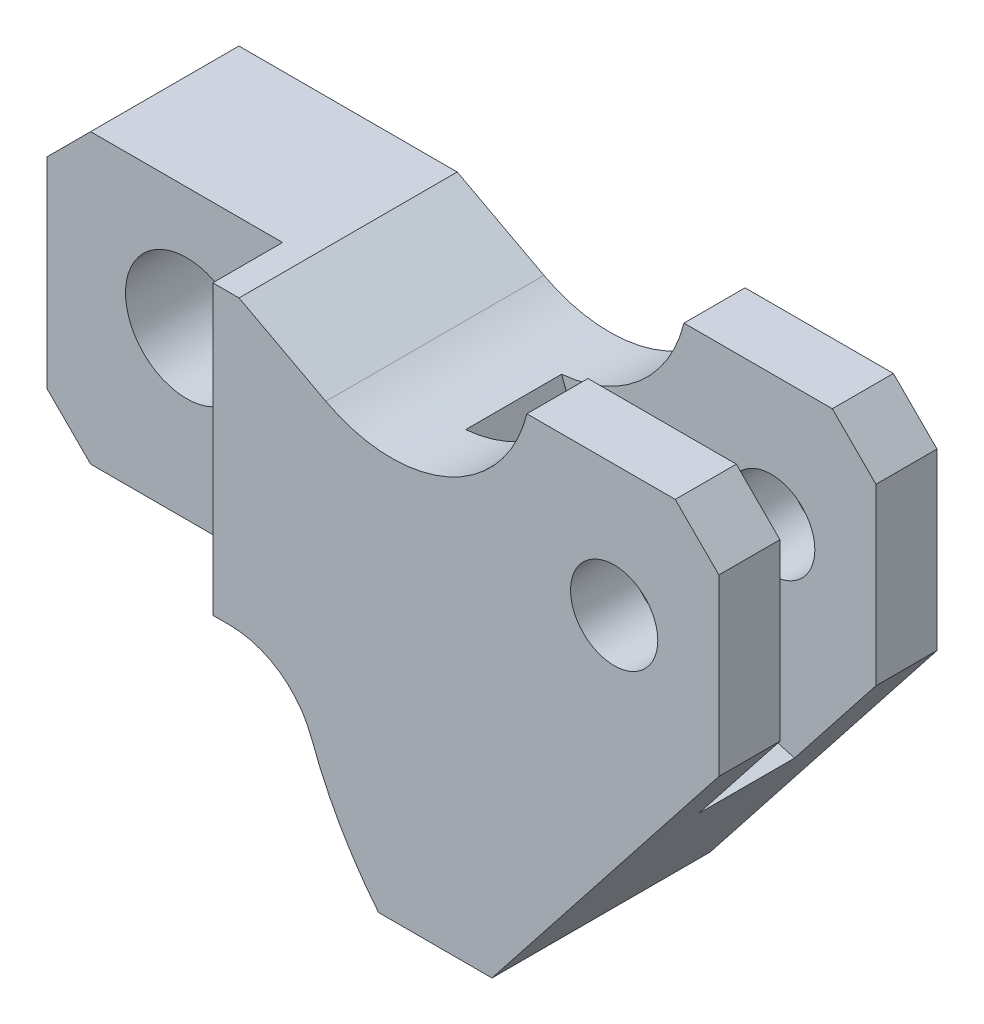
ISO-10303-21;
HEADER;
FILE_DESCRIPTION(('STEP AP214'),'2;1');
FILE_NAME('part.step','',(''),(''),'','','');
FILE_SCHEMA(('AUTOMOTIVE_DESIGN { 1 0 10303 214 1 1 1 1 }'));
ENDSEC;
DATA;
#1=APPLICATION_CONTEXT('core data for automotive mechanical design processes');
#2=APPLICATION_PROTOCOL_DEFINITION('international standard','automotive_design',2000,#1);
#3=PRODUCT_CONTEXT('',#1,'mechanical');
#4=PRODUCT('Part','Part','',(#3));
#5=PRODUCT_RELATED_PRODUCT_CATEGORY('part','',(#4));
#6=PRODUCT_DEFINITION_FORMATION('','',#4);
#7=PRODUCT_DEFINITION_CONTEXT('part definition',#1,'design');
#8=PRODUCT_DEFINITION('design','',#6,#7);
#9=PRODUCT_DEFINITION_SHAPE('','',#8);
#10=(LENGTH_UNIT() NAMED_UNIT(*) SI_UNIT(.MILLI.,.METRE.));
#11=(NAMED_UNIT(*) PLANE_ANGLE_UNIT() SI_UNIT($,.RADIAN.));
#12=(NAMED_UNIT(*) SI_UNIT($,.STERADIAN.) SOLID_ANGLE_UNIT());
#13=UNCERTAINTY_MEASURE_WITH_UNIT(LENGTH_MEASURE(1.E-05),#10,'distance_accuracy_value','');
#14=(GEOMETRIC_REPRESENTATION_CONTEXT(3) GLOBAL_UNCERTAINTY_ASSIGNED_CONTEXT((#13)) GLOBAL_UNIT_ASSIGNED_CONTEXT((#10,
#11,#12)) REPRESENTATION_CONTEXT('',''));
#15=CARTESIAN_POINT('',(0.,0.,0.));
#16=DIRECTION('',(0.,0.,1.));
#17=DIRECTION('',(1.,0.,0.));
#18=AXIS2_PLACEMENT_3D('',#15,#16,#17);
#19=CARTESIAN_POINT('',(37.5323662073748,-3.84,12.5));
#20=DIRECTION('',(0.,0.,-1.));
#21=DIRECTION('',(-1.,0.,0.));
#22=AXIS2_PLACEMENT_3D('',#19,#20,#21);
#23=CYLINDRICAL_SURFACE('',#22,38.);
#24=CARTESIAN_POINT('',(37.5323662073748,-3.84,-5.5));
#25=DIRECTION('',(0.,0.,1.));
#26=DIRECTION('',(1.,0.,0.));
#27=AXIS2_PLACEMENT_3D('',#24,#25,#26);
#28=CIRCLE('',#27,38.);
#29=CARTESIAN_POINT('',(1.50656721275614,-15.9289125565259,-5.5));
#30=VERTEX_POINT('',#29);
#31=CARTESIAN_POINT('',(28.2057199185503,-40.677666443508,-5.5));
#32=VERTEX_POINT('',#31);
#33=EDGE_CURVE('E423',#30,#32,#28,.T.);
#34=ORIENTED_EDGE('',*,*,#33,.F.);
#35=DIRECTION('',(0.,0.,-1.));
#36=VECTOR('',#35,1.);
#37=CARTESIAN_POINT('',(1.50656721275614,-15.9289125565259,12.5));
#38=LINE('',#37,#36);
#39=CARTESIAN_POINT('',(1.50656721275614,-15.9289125565259,5.5));
#40=VERTEX_POINT('',#39);
#41=EDGE_CURVE('E311',#40,#30,#38,.T.);
#42=ORIENTED_EDGE('',*,*,#41,.F.);
#43=CARTESIAN_POINT('',(37.5323662073748,-3.84,5.5));
#44=DIRECTION('',(0.,0.,1.));
#45=DIRECTION('',(1.,0.,0.));
#46=AXIS2_PLACEMENT_3D('',#43,#44,#45);
#47=CIRCLE('',#46,38.);
#48=CARTESIAN_POINT('',(28.2057199185503,-40.677666443508,5.5));
#49=VERTEX_POINT('',#48);
#50=EDGE_CURVE('E243',#40,#49,#47,.T.);
#51=ORIENTED_EDGE('',*,*,#50,.T.);
#52=DIRECTION('',(0.,0.,-1.));
#53=VECTOR('',#52,1.);
#54=CARTESIAN_POINT('',(28.2057199185503,-40.677666443508,12.5));
#55=LINE('',#54,#53);
#56=EDGE_CURVE('E279',#49,#32,#55,.T.);
#57=ORIENTED_EDGE('',*,*,#56,.T.);
#58=EDGE_LOOP('',(#34,#42,#51,#57));
#59=FACE_BOUND('',#58,.T.);
#60=ADVANCED_FACE('F43',(#59),#23,.F.);
#61=CARTESIAN_POINT('',(0.,-8.84000000000001,4.5));
#62=DIRECTION('',(0.,1.,0.));
#63=DIRECTION('',(0.,0.,1.));
#64=AXIS2_PLACEMENT_3D('',#61,#62,#63);
#65=PLANE('',#64);
#66=DIRECTION('',(1.,0.,0.));
#67=VECTOR('',#66,1.);
#68=CARTESIAN_POINT('',(0.,-8.84000000000001,-12.5));
#69=LINE('',#68,#67);
#70=CARTESIAN_POINT('',(-42.4676337926252,-8.84000000000001,-12.5));
#71=VERTEX_POINT('',#70);
#72=CARTESIAN_POINT('',(-17.4552495373706,-8.84000000000001,-12.5));
#73=VERTEX_POINT('',#72);
#74=EDGE_CURVE('E335',#71,#73,#69,.T.);
#75=ORIENTED_EDGE('',*,*,#74,.F.);
#76=DIRECTION('',(0.,0.,1.));
#77=VECTOR('',#76,1.);
#78=CARTESIAN_POINT('',(-42.4676337926252,-8.84000000000001,4.5));
#79=LINE('',#78,#77);
#80=CARTESIAN_POINT('',(-42.4676337926252,-8.84000000000001,4.5));
#81=VERTEX_POINT('',#80);
#82=EDGE_CURVE('E11',#71,#81,#79,.T.);
#83=ORIENTED_EDGE('',*,*,#82,.T.);
#84=DIRECTION('',(1.,0.,0.));
#85=VECTOR('',#84,1.);
#86=CARTESIAN_POINT('',(0.,-8.84000000000001,4.5));
#87=LINE('',#86,#85);
#88=CARTESIAN_POINT('',(-20.4676337926252,-8.84000000000001,4.5));
#89=VERTEX_POINT('',#88);
#90=EDGE_CURVE('E323',#81,#89,#87,.T.);
#91=ORIENTED_EDGE('',*,*,#90,.T.);
#92=DIRECTION('',(0.,0.,-1.));
#93=VECTOR('',#92,1.);
#94=CARTESIAN_POINT('',(-20.4676337926252,-8.84000000000001,12.5));
#95=LINE('',#94,#93);
#96=CARTESIAN_POINT('',(-20.4676337926252,-8.84000000000001,12.5));
#97=VERTEX_POINT('',#96);
#98=EDGE_CURVE('E301',#97,#89,#95,.T.);
#99=ORIENTED_EDGE('',*,*,#98,.F.);
#100=DIRECTION('',(1.,0.,0.));
#101=VECTOR('',#100,1.);
#102=CARTESIAN_POINT('',(0.,-8.84000000000001,12.5));
#103=LINE('',#102,#101);
#104=CARTESIAN_POINT('',(-17.4552495373706,-8.84000000000001,12.5));
#105=VERTEX_POINT('',#104);
#106=EDGE_CURVE('E265',#97,#105,#103,.T.);
#107=ORIENTED_EDGE('',*,*,#106,.T.);
#108=DIRECTION('',(0.,0.,-1.));
#109=VECTOR('',#108,1.);
#110=CARTESIAN_POINT('',(-17.4552495373706,-8.84000000000001,12.5));
#111=LINE('',#110,#109);
#112=EDGE_CURVE('E306',#105,#73,#111,.T.);
#113=ORIENTED_EDGE('',*,*,#112,.T.);
#114=EDGE_LOOP('',(#75,#83,#91,#99,#107,#113));
#115=FACE_BOUND('',#114,.T.);
#116=ADVANCED_FACE('F383',(#115),#65,.T.);
#117=CARTESIAN_POINT('',(-47.4676337926252,0.,4.5));
#118=DIRECTION('',(1.,0.,0.));
#119=DIRECTION('',(0.,1.,0.));
#120=AXIS2_PLACEMENT_3D('',#117,#118,#119);
#121=PLANE('',#120);
#122=DIRECTION('',(0.,-1.,0.));
#123=VECTOR('',#122,1.);
#124=CARTESIAN_POINT('',(-47.4676337926252,0.,-12.5));
#125=LINE('',#124,#123);
#126=CARTESIAN_POINT('',(-47.4676337926252,-13.84,-12.5));
#127=VERTEX_POINT('',#126);
#128=CARTESIAN_POINT('',(-47.4676337926252,-36.84,-12.5));
#129=VERTEX_POINT('',#128);
#130=EDGE_CURVE('E331',#127,#129,#125,.T.);
#131=ORIENTED_EDGE('',*,*,#130,.T.);
#132=DIRECTION('',(0.,0.,1.));
#133=VECTOR('',#132,1.);
#134=CARTESIAN_POINT('',(-47.4676337926252,-36.84,4.5));
#135=LINE('',#134,#133);
#136=CARTESIAN_POINT('',(-47.4676337926252,-36.84,4.5));
#137=VERTEX_POINT('',#136);
#138=EDGE_CURVE('E64',#129,#137,#135,.T.);
#139=ORIENTED_EDGE('',*,*,#138,.T.);
#140=DIRECTION('',(0.,-1.,0.));
#141=VECTOR('',#140,1.);
#142=CARTESIAN_POINT('',(-47.4676337926252,0.,4.5));
#143=LINE('',#142,#141);
#144=CARTESIAN_POINT('',(-47.4676337926252,-13.84,4.5));
#145=VERTEX_POINT('',#144);
#146=EDGE_CURVE('E324',#145,#137,#143,.T.);
#147=ORIENTED_EDGE('',*,*,#146,.F.);
#148=DIRECTION('',(0.,0.,-1.));
#149=VECTOR('',#148,1.);
#150=CARTESIAN_POINT('',(-47.4676337926252,-13.84,-12.5));
#151=LINE('',#150,#149);
#152=EDGE_CURVE('E356',#145,#127,#151,.T.);
#153=ORIENTED_EDGE('',*,*,#152,.T.);
#154=EDGE_LOOP('',(#131,#139,#147,#153));
#155=FACE_BOUND('',#154,.T.);
#156=ADVANCED_FACE('F379',(#155),#121,.F.);
#157=CARTESIAN_POINT('',(-31.4676337926252,-22.84,4.5));
#158=DIRECTION('',(0.,0.,-1.));
#159=DIRECTION('',(-1.,0.,0.));
#160=AXIS2_PLACEMENT_3D('',#157,#158,#159);
#161=CYLINDRICAL_SURFACE('',#160,7.);
#162=CARTESIAN_POINT('',(-31.4676337926252,-22.84,4.5));
#163=DIRECTION('',(0.,0.,1.));
#164=DIRECTION('',(1.,0.,0.));
#165=AXIS2_PLACEMENT_3D('',#162,#163,#164);
#166=CIRCLE('',#165,7.);
#167=CARTESIAN_POINT('',(-24.4676337926252,-22.84,4.5));
#168=VERTEX_POINT('',#167);
#169=EDGE_CURVE('E316',#168,#168,#166,.T.);
#170=ORIENTED_EDGE('',*,*,#169,.T.);
#171=EDGE_LOOP('',(#170));
#172=FACE_BOUND('',#171,.T.);
#173=CARTESIAN_POINT('',(-31.4676337926252,-22.84,-12.5));
#174=DIRECTION('',(0.,0.,1.));
#175=DIRECTION('',(1.,0.,0.));
#176=AXIS2_PLACEMENT_3D('',#173,#174,#175);
#177=CIRCLE('',#176,7.);
#178=CARTESIAN_POINT('',(-24.4676337926252,-22.84,-12.5));
#179=VERTEX_POINT('',#178);
#180=EDGE_CURVE('E312',#179,#179,#177,.T.);
#181=ORIENTED_EDGE('',*,*,#180,.F.);
#182=EDGE_LOOP('',(#181));
#183=FACE_BOUND('',#182,.T.);
#184=ADVANCED_FACE('F478',(#172,#183),#161,.F.);
#185=CARTESIAN_POINT('',(0.,-41.84,4.5));
#186=DIRECTION('',(0.,1.,0.));
#187=DIRECTION('',(-1.,0.,0.));
#188=AXIS2_PLACEMENT_3D('',#185,#186,#187);
#189=PLANE('',#188);
#190=DIRECTION('',(1.,0.,0.));
#191=VECTOR('',#190,1.);
#192=CARTESIAN_POINT('',(0.,-41.84,4.5));
#193=LINE('',#192,#191);
#194=CARTESIAN_POINT('',(-42.4676337926251,-41.84,4.5));
#195=VERTEX_POINT('',#194);
#196=CARTESIAN_POINT('',(-20.4676337926252,-41.84,4.5));
#197=VERTEX_POINT('',#196);
#198=EDGE_CURVE('E330',#195,#197,#193,.T.);
#199=ORIENTED_EDGE('',*,*,#198,.F.);
#200=DIRECTION('',(0.,0.,-1.));
#201=VECTOR('',#200,1.);
#202=CARTESIAN_POINT('',(-42.4676337926251,-41.84,4.5));
#203=LINE('',#202,#201);
#204=CARTESIAN_POINT('',(-42.4676337926251,-41.84,-12.5));
#205=VERTEX_POINT('',#204);
#206=EDGE_CURVE('E359',#195,#205,#203,.T.);
#207=ORIENTED_EDGE('',*,*,#206,.T.);
#208=DIRECTION('',(1.,0.,0.));
#209=VECTOR('',#208,1.);
#210=CARTESIAN_POINT('',(0.,-41.84,-12.5));
#211=LINE('',#210,#209);
#212=CARTESIAN_POINT('',(-18.5358006446889,-41.84,-12.5));
#213=VERTEX_POINT('',#212);
#214=EDGE_CURVE('E319',#205,#213,#211,.T.);
#215=ORIENTED_EDGE('',*,*,#214,.T.);
#216=DIRECTION('',(0.,0.,-1.));
#217=VECTOR('',#216,1.);
#218=CARTESIAN_POINT('',(-18.5358006446889,-41.84,12.5));
#219=LINE('',#218,#217);
#220=CARTESIAN_POINT('',(-18.5358006446889,-41.84,12.5));
#221=VERTEX_POINT('',#220);
#222=EDGE_CURVE('E298',#221,#213,#219,.T.);
#223=ORIENTED_EDGE('',*,*,#222,.F.);
#224=DIRECTION('',(1.,0.,0.));
#225=VECTOR('',#224,1.);
#226=CARTESIAN_POINT('',(0.,-41.84,12.5));
#227=LINE('',#226,#225);
#228=CARTESIAN_POINT('',(-20.4676337926252,-41.84,12.5));
#229=VERTEX_POINT('',#228);
#230=EDGE_CURVE('E270',#229,#221,#227,.T.);
#231=ORIENTED_EDGE('',*,*,#230,.F.);
#232=DIRECTION('',(0.,0.,-1.));
#233=VECTOR('',#232,1.);
#234=CARTESIAN_POINT('',(-20.4676337926252,-41.84,12.5));
#235=LINE('',#234,#233);
#236=EDGE_CURVE('E304',#229,#197,#235,.T.);
#237=ORIENTED_EDGE('',*,*,#236,.T.);
#238=EDGE_LOOP('',(#199,#207,#215,#223,#231,#237));
#239=FACE_BOUND('',#238,.T.);
#240=ADVANCED_FACE('F373',(#239),#189,.F.);
#241=CARTESIAN_POINT('',(0.,0.,4.5));
#242=DIRECTION('',(0.,0.,1.));
#243=DIRECTION('',(1.,0.,0.));
#244=AXIS2_PLACEMENT_3D('',#241,#242,#243);
#245=PLANE('',#244);
#246=ORIENTED_EDGE('',*,*,#169,.F.);
#247=EDGE_LOOP('',(#246));
#248=FACE_BOUND('',#247,.T.);
#249=ORIENTED_EDGE('',*,*,#146,.T.);
#250=DIRECTION('',(-0.707106781186547,0.707106781186549,0.));
#251=VECTOR('',#250,1.);
#252=CARTESIAN_POINT('',(-42.1538168963126,-42.1538168963125,4.5));
#253=LINE('',#252,#251);
#254=EDGE_CURVE('E55',#137,#195,#253,.F.);
#255=ORIENTED_EDGE('',*,*,#254,.T.);
#256=ORIENTED_EDGE('',*,*,#198,.T.);
#257=DIRECTION('',(0.,-1.,0.));
#258=VECTOR('',#257,1.);
#259=CARTESIAN_POINT('',(-20.4676337926252,0.,4.5));
#260=LINE('',#259,#258);
#261=EDGE_CURVE('E317',#89,#197,#260,.T.);
#262=ORIENTED_EDGE('',*,*,#261,.F.);
#263=ORIENTED_EDGE('',*,*,#90,.F.);
#264=DIRECTION('',(-0.707106781186548,-0.707106781186547,0.));
#265=VECTOR('',#264,1.);
#266=CARTESIAN_POINT('',(-16.8138168963125,16.8138168963126,4.5));
#267=LINE('',#266,#265);
#268=EDGE_CURVE('E365',#81,#145,#267,.T.);
#269=ORIENTED_EDGE('',*,*,#268,.T.);
#270=EDGE_LOOP('',(#249,#255,#256,#262,#263,#269));
#271=FACE_BOUND('',#270,.T.);
#272=ADVANCED_FACE('F366',(#248,#271),#245,.T.);
#273=CARTESIAN_POINT('',(0.,0.,-12.5));
#274=DIRECTION('',(0.,0.,1.));
#275=DIRECTION('',(1.,0.,0.));
#276=AXIS2_PLACEMENT_3D('',#273,#274,#275);
#277=PLANE('',#276);
#278=ORIENTED_EDGE('',*,*,#180,.T.);
#279=EDGE_LOOP('',(#278));
#280=FACE_BOUND('',#279,.T.);
#281=DIRECTION('',(1.,0.,0.));
#282=VECTOR('',#281,1.);
#283=CARTESIAN_POINT('',(0.,-3.84,-12.5));
#284=LINE('',#283,#282);
#285=CARTESIAN_POINT('',(15.5323662073748,-3.84,-12.5));
#286=VERTEX_POINT('',#285);
#287=CARTESIAN_POINT('',(32.5323662073748,-3.84,-12.5));
#288=VERTEX_POINT('',#287);
#289=EDGE_CURVE('E200',#286,#288,#284,.T.);
#290=ORIENTED_EDGE('',*,*,#289,.T.);
#291=DIRECTION('',(-0.707106781186549,0.707106781186547,0.));
#292=VECTOR('',#291,1.);
#293=CARTESIAN_POINT('',(37.5323662073748,-8.84,-12.5));
#294=LINE('',#293,#292);
#295=CARTESIAN_POINT('',(37.5323662073748,-8.84000000000001,-12.5));
#296=VERTEX_POINT('',#295);
#297=EDGE_CURVE('E354',#288,#296,#294,.F.);
#298=ORIENTED_EDGE('',*,*,#297,.T.);
#299=DIRECTION('',(0.,-1.,0.));
#300=VECTOR('',#299,1.);
#301=CARTESIAN_POINT('',(37.5323662073748,0.,-12.5));
#302=LINE('',#301,#300);
#303=CARTESIAN_POINT('',(37.5323662073748,-28.84,-12.5));
#304=VERTEX_POINT('',#303);
#305=EDGE_CURVE('E214',#296,#304,#302,.T.);
#306=ORIENTED_EDGE('',*,*,#305,.T.);
#307=DIRECTION('',(-0.618872226603513,-0.785491672227536,0.));
#308=VECTOR('',#307,1.);
#309=CARTESIAN_POINT('',(37.1770350140687,-29.2909972838117,-12.5));
#310=LINE('',#309,#308);
#311=CARTESIAN_POINT('',(11.5323662073748,-61.84,-12.5));
#312=VERTEX_POINT('',#311);
#313=EDGE_CURVE('E259',#304,#312,#310,.T.);
#314=ORIENTED_EDGE('',*,*,#313,.T.);
#315=DIRECTION('',(-1.,0.,0.));
#316=VECTOR('',#315,1.);
#317=CARTESIAN_POINT('',(0.,-61.84,-12.5));
#318=LINE('',#317,#316);
#319=CARTESIAN_POINT('',(-1.46763379262515,-61.84,-12.5));
#320=VERTEX_POINT('',#319);
#321=EDGE_CURVE('E288',#312,#320,#318,.T.);
#322=ORIENTED_EDGE('',*,*,#321,.T.);
#323=CARTESIAN_POINT('',(34.9455217358851,-32.1233025984293,-12.5));
#324=DIRECTION('',(0.,0.,1.));
#325=DIRECTION('',(1.,0.,0.));
#326=AXIS2_PLACEMENT_3D('',#323,#324,#325);
#327=CIRCLE('',#326,47.);
#328=CARTESIAN_POINT('',(-9.15311250774611,-48.3809302804262,-12.5));
#329=VERTEX_POINT('',#328);
#330=EDGE_CURVE('E282',#329,#320,#327,.T.);
#331=ORIENTED_EDGE('',*,*,#330,.F.);
#332=CARTESIAN_POINT('',(-18.5358006446889,-51.84,-12.5));
#333=DIRECTION('',(0.,0.,1.));
#334=DIRECTION('',(1.,0.,0.));
#335=AXIS2_PLACEMENT_3D('',#332,#333,#334);
#336=CIRCLE('',#335,10.);
#337=EDGE_CURVE('E281',#213,#329,#336,.F.);
#338=ORIENTED_EDGE('',*,*,#337,.F.);
#339=ORIENTED_EDGE('',*,*,#214,.F.);
#340=DIRECTION('',(0.707106781186547,-0.707106781186549,0.));
#341=VECTOR('',#340,1.);
#342=CARTESIAN_POINT('',(-42.4676337926251,-41.84,-12.5));
#343=LINE('',#342,#341);
#344=EDGE_CURVE('E352',#205,#129,#343,.F.);
#345=ORIENTED_EDGE('',*,*,#344,.T.);
#346=ORIENTED_EDGE('',*,*,#130,.F.);
#347=DIRECTION('',(0.707106781186548,0.707106781186547,0.));
#348=VECTOR('',#347,1.);
#349=CARTESIAN_POINT('',(-47.4676337926252,-13.84,-12.5));
#350=LINE('',#349,#348);
#351=EDGE_CURVE('E351',#127,#71,#350,.T.);
#352=ORIENTED_EDGE('',*,*,#351,.T.);
#353=ORIENTED_EDGE('',*,*,#74,.T.);
#354=DIRECTION('',(0.882947592858927,-0.469471562785891,0.));
#355=VECTOR('',#354,1.);
#356=CARTESIAN_POINT('',(-7.51154500457426,-14.1271614857428,-12.5));
#357=LINE('',#356,#355);
#358=CARTESIAN_POINT('',(-7.51154500457427,-14.1271614857428,-12.5));
#359=VERTEX_POINT('',#358);
#360=EDGE_CURVE('E205',#73,#359,#357,.T.);
#361=ORIENTED_EDGE('',*,*,#360,.T.);
#362=CARTESIAN_POINT('',(0.,0.,-12.5));
#363=DIRECTION('',(0.,0.,1.));
#364=DIRECTION('',(1.,0.,0.));
#365=AXIS2_PLACEMENT_3D('',#362,#363,#364);
#366=CIRCLE('',#365,16.);
#367=EDGE_CURVE('E191',#359,#286,#366,.T.);
#368=ORIENTED_EDGE('',*,*,#367,.T.);
#369=EDGE_LOOP('',(#290,#298,#306,#314,#322,#331,#338,#339,#345,#346,#352,#353,#361,#368));
#370=FACE_BOUND('',#369,.T.);
#371=CARTESIAN_POINT('',(25.5323662073748,-18.84,-12.5));
#372=DIRECTION('',(0.,0.,1.));
#373=DIRECTION('',(1.,0.,0.));
#374=AXIS2_PLACEMENT_3D('',#371,#372,#373);
#375=CIRCLE('',#374,5.);
#376=CARTESIAN_POINT('',(30.5323662073748,-18.84,-12.5));
#377=VERTEX_POINT('',#376);
#378=EDGE_CURVE('E216',#377,#377,#375,.T.);
#379=ORIENTED_EDGE('',*,*,#378,.T.);
#380=EDGE_LOOP('',(#379));
#381=FACE_BOUND('',#380,.T.);
#382=ADVANCED_FACE('F197',(#280,#370,#381),#277,.F.);
#383=CARTESIAN_POINT('',(-20.4676337926252,0.,12.5));
#384=DIRECTION('',(1.,0.,0.));
#385=DIRECTION('',(0.,1.,0.));
#386=AXIS2_PLACEMENT_3D('',#383,#384,#385);
#387=PLANE('',#386);
#388=ORIENTED_EDGE('',*,*,#98,.T.);
#389=ORIENTED_EDGE('',*,*,#261,.T.);
#390=ORIENTED_EDGE('',*,*,#236,.F.);
#391=DIRECTION('',(0.,-1.,0.));
#392=VECTOR('',#391,1.);
#393=CARTESIAN_POINT('',(-20.4676337926252,0.,12.5));
#394=LINE('',#393,#392);
#395=EDGE_CURVE('E264',#97,#229,#394,.T.);
#396=ORIENTED_EDGE('',*,*,#395,.F.);
#397=EDGE_LOOP('',(#388,#389,#390,#396));
#398=FACE_BOUND('',#397,.T.);
#399=ADVANCED_FACE('F472',(#398),#387,.F.);
#400=CARTESIAN_POINT('',(0.,0.,12.5));
#401=DIRECTION('',(0.,0.,-1.));
#402=DIRECTION('',(-1.,0.,0.));
#403=AXIS2_PLACEMENT_3D('',#400,#401,#402);
#404=CYLINDRICAL_SURFACE('',#403,16.);
#405=ORIENTED_EDGE('',*,*,#367,.F.);
#406=DIRECTION('',(0.,0.,-1.));
#407=VECTOR('',#406,1.);
#408=CARTESIAN_POINT('',(-7.51154500457427,-14.1271614857428,12.5));
#409=LINE('',#408,#407);
#410=CARTESIAN_POINT('',(-7.51154500457427,-14.1271614857428,12.5));
#411=VERTEX_POINT('',#410);
#412=EDGE_CURVE('E313',#411,#359,#409,.T.);
#413=ORIENTED_EDGE('',*,*,#412,.F.);
#414=CARTESIAN_POINT('',(0.,0.,12.5));
#415=DIRECTION('',(0.,0.,1.));
#416=DIRECTION('',(1.,0.,0.));
#417=AXIS2_PLACEMENT_3D('',#414,#415,#416);
#418=CIRCLE('',#417,16.);
#419=CARTESIAN_POINT('',(15.5323662073748,-3.84,12.5));
#420=VERTEX_POINT('',#419);
#421=EDGE_CURVE('E258',#411,#420,#418,.T.);
#422=ORIENTED_EDGE('',*,*,#421,.T.);
#423=DIRECTION('',(0.,0.,-1.));
#424=VECTOR('',#423,1.);
#425=CARTESIAN_POINT('',(15.5323662073748,-3.84,12.5));
#426=LINE('',#425,#424);
#427=CARTESIAN_POINT('',(15.5323662073748,-3.84,5.5));
#428=VERTEX_POINT('',#427);
#429=EDGE_CURVE('E238',#420,#428,#426,.T.);
#430=ORIENTED_EDGE('',*,*,#429,.T.);
#431=CARTESIAN_POINT('',(0.,0.,5.5));
#432=DIRECTION('',(0.,0.,1.));
#433=DIRECTION('',(1.,0.,0.));
#434=AXIS2_PLACEMENT_3D('',#431,#432,#433);
#435=CIRCLE('',#434,16.);
#436=EDGE_CURVE('E226',#40,#428,#435,.T.);
#437=ORIENTED_EDGE('',*,*,#436,.F.);
#438=ORIENTED_EDGE('',*,*,#41,.T.);
#439=CARTESIAN_POINT('',(0.,0.,-5.5));
#440=DIRECTION('',(0.,0.,1.));
#441=DIRECTION('',(1.,0.,0.));
#442=AXIS2_PLACEMENT_3D('',#439,#440,#441);
#443=CIRCLE('',#442,16.);
#444=CARTESIAN_POINT('',(15.5323662073748,-3.84,-5.5));
#445=VERTEX_POINT('',#444);
#446=EDGE_CURVE('E222',#30,#445,#443,.T.);
#447=ORIENTED_EDGE('',*,*,#446,.T.);
#448=DIRECTION('',(0.,0.,1.));
#449=VECTOR('',#448,1.);
#450=CARTESIAN_POINT('',(15.5323662073748,-3.84,-12.5));
#451=LINE('',#450,#449);
#452=EDGE_CURVE('E211',#286,#445,#451,.T.);
#453=ORIENTED_EDGE('',*,*,#452,.F.);
#454=EDGE_LOOP('',(#405,#413,#422,#430,#437,#438,#447,#453));
#455=FACE_BOUND('',#454,.T.);
#456=ADVANCED_FACE('F217',(#455),#404,.F.);
#457=CARTESIAN_POINT('',(-7.51154500457426,-14.1271614857428,12.5));
#458=DIRECTION('',(0.469471562785891,0.882947592858927,0.));
#459=DIRECTION('',(-0.882947592858927,0.469471562785891,0.));
#460=AXIS2_PLACEMENT_3D('',#457,#458,#459);
#461=PLANE('',#460);
#462=ORIENTED_EDGE('',*,*,#360,.F.);
#463=ORIENTED_EDGE('',*,*,#112,.F.);
#464=DIRECTION('',(0.882947592858927,-0.469471562785891,0.));
#465=VECTOR('',#464,1.);
#466=CARTESIAN_POINT('',(-7.51154500457426,-14.1271614857428,12.5));
#467=LINE('',#466,#465);
#468=EDGE_CURVE('E256',#105,#411,#467,.T.);
#469=ORIENTED_EDGE('',*,*,#468,.T.);
#470=ORIENTED_EDGE('',*,*,#412,.T.);
#471=EDGE_LOOP('',(#462,#463,#469,#470));
#472=FACE_BOUND('',#471,.T.);
#473=ADVANCED_FACE('F389',(#472),#461,.T.);
#474=CARTESIAN_POINT('',(-18.5358006446889,-51.84,12.5));
#475=DIRECTION('',(0.,0.,-1.));
#476=DIRECTION('',(-1.,0.,0.));
#477=AXIS2_PLACEMENT_3D('',#474,#475,#476);
#478=CYLINDRICAL_SURFACE('',#477,10.);
#479=ORIENTED_EDGE('',*,*,#337,.T.);
#480=DIRECTION('',(0.,0.,-1.));
#481=VECTOR('',#480,1.);
#482=CARTESIAN_POINT('',(-9.15311250774611,-48.3809302804262,12.5));
#483=LINE('',#482,#481);
#484=CARTESIAN_POINT('',(-9.15311250774611,-48.3809302804262,12.5));
#485=VERTEX_POINT('',#484);
#486=EDGE_CURVE('E296',#485,#329,#483,.T.);
#487=ORIENTED_EDGE('',*,*,#486,.F.);
#488=CARTESIAN_POINT('',(-18.5358006446889,-51.84,12.5));
#489=DIRECTION('',(0.,0.,1.));
#490=DIRECTION('',(1.,0.,0.));
#491=AXIS2_PLACEMENT_3D('',#488,#489,#490);
#492=CIRCLE('',#491,10.);
#493=EDGE_CURVE('E267',#221,#485,#492,.F.);
#494=ORIENTED_EDGE('',*,*,#493,.F.);
#495=ORIENTED_EDGE('',*,*,#222,.T.);
#496=EDGE_LOOP('',(#479,#487,#494,#495));
#497=FACE_BOUND('',#496,.T.);
#498=ADVANCED_FACE('F513',(#497),#478,.F.);
#499=CARTESIAN_POINT('',(34.9455217358851,-32.1233025984293,12.5));
#500=DIRECTION('',(0.,0.,-1.));
#501=DIRECTION('',(-1.,0.,0.));
#502=AXIS2_PLACEMENT_3D('',#499,#500,#501);
#503=CYLINDRICAL_SURFACE('',#502,47.);
#504=ORIENTED_EDGE('',*,*,#330,.T.);
#505=DIRECTION('',(0.,0.,-1.));
#506=VECTOR('',#505,1.);
#507=CARTESIAN_POINT('',(-1.46763379262515,-61.84,12.5));
#508=LINE('',#507,#506);
#509=CARTESIAN_POINT('',(-1.46763379262515,-61.84,12.5));
#510=VERTEX_POINT('',#509);
#511=EDGE_CURVE('E294',#510,#320,#508,.T.);
#512=ORIENTED_EDGE('',*,*,#511,.F.);
#513=CARTESIAN_POINT('',(34.9455217358851,-32.1233025984293,12.5));
#514=DIRECTION('',(0.,0.,1.));
#515=DIRECTION('',(1.,0.,0.));
#516=AXIS2_PLACEMENT_3D('',#513,#514,#515);
#517=CIRCLE('',#516,47.);
#518=EDGE_CURVE('E271',#485,#510,#517,.T.);
#519=ORIENTED_EDGE('',*,*,#518,.F.);
#520=ORIENTED_EDGE('',*,*,#486,.T.);
#521=EDGE_LOOP('',(#504,#512,#519,#520));
#522=FACE_BOUND('',#521,.T.);
#523=ADVANCED_FACE('F524',(#522),#503,.T.);
#524=CARTESIAN_POINT('',(0.,-61.84,12.5));
#525=DIRECTION('',(0.,-1.,0.));
#526=DIRECTION('',(0.,0.,-1.));
#527=AXIS2_PLACEMENT_3D('',#524,#525,#526);
#528=PLANE('',#527);
#529=ORIENTED_EDGE('',*,*,#321,.F.);
#530=DIRECTION('',(0.,0.,-1.));
#531=VECTOR('',#530,1.);
#532=CARTESIAN_POINT('',(11.5323662073748,-61.84,12.5));
#533=LINE('',#532,#531);
#534=CARTESIAN_POINT('',(11.5323662073748,-61.84,12.5));
#535=VERTEX_POINT('',#534);
#536=EDGE_CURVE('E295',#535,#312,#533,.T.);
#537=ORIENTED_EDGE('',*,*,#536,.F.);
#538=DIRECTION('',(-1.,0.,0.));
#539=VECTOR('',#538,1.);
#540=CARTESIAN_POINT('',(0.,-61.84,12.5));
#541=LINE('',#540,#539);
#542=EDGE_CURVE('E272',#535,#510,#541,.T.);
#543=ORIENTED_EDGE('',*,*,#542,.T.);
#544=ORIENTED_EDGE('',*,*,#511,.T.);
#545=EDGE_LOOP('',(#529,#537,#543,#544));
#546=FACE_BOUND('',#545,.T.);
#547=ADVANCED_FACE('F533',(#546),#528,.T.);
#548=CARTESIAN_POINT('',(37.1770350140687,-29.2909972838117,12.5));
#549=DIRECTION('',(0.785491672227536,-0.618872226603513,0.));
#550=DIRECTION('',(0.618872226603513,0.785491672227536,0.));
#551=AXIS2_PLACEMENT_3D('',#548,#549,#550);
#552=PLANE('',#551);
#553=ORIENTED_EDGE('',*,*,#313,.F.);
#554=DIRECTION('',(0.,0.,1.));
#555=VECTOR('',#554,1.);
#556=CARTESIAN_POINT('',(37.5323662073748,-28.84,-12.5));
#557=LINE('',#556,#555);
#558=CARTESIAN_POINT('',(37.5323662073748,-28.84,-5.5));
#559=VERTEX_POINT('',#558);
#560=EDGE_CURVE('E224',#304,#559,#557,.T.);
#561=ORIENTED_EDGE('',*,*,#560,.T.);
#562=DIRECTION('',(-0.618872226603513,-0.785491672227536,0.));
#563=VECTOR('',#562,1.);
#564=CARTESIAN_POINT('',(37.1770350140687,-29.2909972838117,-5.5));
#565=LINE('',#564,#563);
#566=EDGE_CURVE('E436',#559,#32,#565,.T.);
#567=ORIENTED_EDGE('',*,*,#566,.T.);
#568=ORIENTED_EDGE('',*,*,#56,.F.);
#569=DIRECTION('',(-0.618872226603513,-0.785491672227536,0.));
#570=VECTOR('',#569,1.);
#571=CARTESIAN_POINT('',(37.1770350140687,-29.2909972838117,5.5));
#572=LINE('',#571,#570);
#573=CARTESIAN_POINT('',(37.5323662073748,-28.84,5.5));
#574=VERTEX_POINT('',#573);
#575=EDGE_CURVE('E249',#574,#49,#572,.T.);
#576=ORIENTED_EDGE('',*,*,#575,.F.);
#577=DIRECTION('',(0.,0.,-1.));
#578=VECTOR('',#577,1.);
#579=CARTESIAN_POINT('',(37.5323662073748,-28.84,12.5));
#580=LINE('',#579,#578);
#581=CARTESIAN_POINT('',(37.5323662073748,-28.84,12.5));
#582=VERTEX_POINT('',#581);
#583=EDGE_CURVE('E202',#582,#574,#580,.T.);
#584=ORIENTED_EDGE('',*,*,#583,.F.);
#585=DIRECTION('',(-0.618872226603513,-0.785491672227536,0.));
#586=VECTOR('',#585,1.);
#587=CARTESIAN_POINT('',(37.1770350140687,-29.2909972838117,12.5));
#588=LINE('',#587,#586);
#589=EDGE_CURVE('E277',#582,#535,#588,.T.);
#590=ORIENTED_EDGE('',*,*,#589,.T.);
#591=ORIENTED_EDGE('',*,*,#536,.T.);
#592=EDGE_LOOP('',(#553,#561,#567,#568,#576,#584,#590,#591));
#593=FACE_BOUND('',#592,.T.);
#594=ADVANCED_FACE('F411',(#593),#552,.T.);
#595=CARTESIAN_POINT('',(0.,0.,12.5));
#596=DIRECTION('',(0.,0.,1.));
#597=DIRECTION('',(1.,0.,0.));
#598=AXIS2_PLACEMENT_3D('',#595,#596,#597);
#599=PLANE('',#598);
#600=DIRECTION('',(0.,-1.,0.));
#601=VECTOR('',#600,1.);
#602=CARTESIAN_POINT('',(37.5323662073748,0.,12.5));
#603=LINE('',#602,#601);
#604=CARTESIAN_POINT('',(37.5323662073748,-8.84000000000004,12.5));
#605=VERTEX_POINT('',#604);
#606=EDGE_CURVE('E231',#605,#582,#603,.T.);
#607=ORIENTED_EDGE('',*,*,#606,.F.);
#608=DIRECTION('',(0.707106781186546,-0.707106781186549,0.));
#609=VECTOR('',#608,1.);
#610=CARTESIAN_POINT('',(14.3461831036875,14.3461831036874,12.5));
#611=LINE('',#610,#609);
#612=CARTESIAN_POINT('',(32.5323662073748,-3.84,12.5));
#613=VERTEX_POINT('',#612);
#614=EDGE_CURVE('E342',#605,#613,#611,.F.);
#615=ORIENTED_EDGE('',*,*,#614,.T.);
#616=DIRECTION('',(1.,0.,0.));
#617=VECTOR('',#616,1.);
#618=CARTESIAN_POINT('',(0.,-3.84,12.5));
#619=LINE('',#618,#617);
#620=EDGE_CURVE('E236',#420,#613,#619,.T.);
#621=ORIENTED_EDGE('',*,*,#620,.F.);
#622=ORIENTED_EDGE('',*,*,#421,.F.);
#623=ORIENTED_EDGE('',*,*,#468,.F.);
#624=ORIENTED_EDGE('',*,*,#106,.F.);
#625=ORIENTED_EDGE('',*,*,#395,.T.);
#626=ORIENTED_EDGE('',*,*,#230,.T.);
#627=ORIENTED_EDGE('',*,*,#493,.T.);
#628=ORIENTED_EDGE('',*,*,#518,.T.);
#629=ORIENTED_EDGE('',*,*,#542,.F.);
#630=ORIENTED_EDGE('',*,*,#589,.F.);
#631=EDGE_LOOP('',(#607,#615,#621,#622,#623,#624,#625,#626,#627,#628,#629,#630));
#632=FACE_BOUND('',#631,.T.);
#633=CARTESIAN_POINT('',(25.5323662073748,-18.84,12.5));
#634=DIRECTION('',(0.,0.,1.));
#635=DIRECTION('',(1.,0.,0.));
#636=AXIS2_PLACEMENT_3D('',#633,#634,#635);
#637=CIRCLE('',#636,5.);
#638=CARTESIAN_POINT('',(30.5323662073748,-18.84,12.5));
#639=VERTEX_POINT('',#638);
#640=EDGE_CURVE('E234',#639,#639,#637,.T.);
#641=ORIENTED_EDGE('',*,*,#640,.F.);
#642=EDGE_LOOP('',(#641));
#643=FACE_BOUND('',#642,.T.);
#644=ADVANCED_FACE('F393',(#632,#643),#599,.T.);
#645=CARTESIAN_POINT('',(37.5323662073748,0.,12.5));
#646=DIRECTION('',(1.,0.,0.));
#647=DIRECTION('',(0.,1.,0.));
#648=AXIS2_PLACEMENT_3D('',#645,#646,#647);
#649=PLANE('',#648);
#650=DIRECTION('',(0.,-1.,0.));
#651=VECTOR('',#650,1.);
#652=CARTESIAN_POINT('',(37.5323662073748,0.,5.5));
#653=LINE('',#652,#651);
#654=CARTESIAN_POINT('',(37.5323662073748,-8.84000000000004,5.5));
#655=VERTEX_POINT('',#654);
#656=EDGE_CURVE('E250',#655,#574,#653,.T.);
#657=ORIENTED_EDGE('',*,*,#656,.F.);
#658=DIRECTION('',(0.,0.,1.));
#659=VECTOR('',#658,1.);
#660=CARTESIAN_POINT('',(37.5323662073748,-8.84000000000004,12.5));
#661=LINE('',#660,#659);
#662=EDGE_CURVE('E343',#655,#605,#661,.T.);
#663=ORIENTED_EDGE('',*,*,#662,.T.);
#664=ORIENTED_EDGE('',*,*,#606,.T.);
#665=ORIENTED_EDGE('',*,*,#583,.T.);
#666=EDGE_LOOP('',(#657,#663,#664,#665));
#667=FACE_BOUND('',#666,.T.);
#668=ADVANCED_FACE('F407',(#667),#649,.T.);
#669=CARTESIAN_POINT('',(25.5323662073748,-18.84,12.5));
#670=DIRECTION('',(0.,0.,-1.));
#671=DIRECTION('',(-1.,0.,0.));
#672=AXIS2_PLACEMENT_3D('',#669,#670,#671);
#673=CYLINDRICAL_SURFACE('',#672,5.);
#674=ORIENTED_EDGE('',*,*,#640,.T.);
#675=EDGE_LOOP('',(#674));
#676=FACE_BOUND('',#675,.T.);
#677=CARTESIAN_POINT('',(25.5323662073748,-18.84,5.5));
#678=DIRECTION('',(0.,0.,1.));
#679=DIRECTION('',(1.,0.,0.));
#680=AXIS2_PLACEMENT_3D('',#677,#678,#679);
#681=CIRCLE('',#680,5.);
#682=CARTESIAN_POINT('',(30.5323662073748,-18.84,5.5));
#683=VERTEX_POINT('',#682);
#684=EDGE_CURVE('E225',#683,#683,#681,.T.);
#685=ORIENTED_EDGE('',*,*,#684,.F.);
#686=EDGE_LOOP('',(#685));
#687=FACE_BOUND('',#686,.T.);
#688=ADVANCED_FACE('F544',(#676,#687),#673,.F.);
#689=CARTESIAN_POINT('',(0.,-3.84,12.5));
#690=DIRECTION('',(0.,1.,0.));
#691=DIRECTION('',(-1.,0.,0.));
#692=AXIS2_PLACEMENT_3D('',#689,#690,#691);
#693=PLANE('',#692);
#694=ORIENTED_EDGE('',*,*,#620,.T.);
#695=DIRECTION('',(0.,0.,-1.));
#696=VECTOR('',#695,1.);
#697=CARTESIAN_POINT('',(32.5323662073748,-3.84,12.5));
#698=LINE('',#697,#696);
#699=CARTESIAN_POINT('',(32.5323662073748,-3.84,5.5));
#700=VERTEX_POINT('',#699);
#701=EDGE_CURVE('E328',#613,#700,#698,.T.);
#702=ORIENTED_EDGE('',*,*,#701,.T.);
#703=DIRECTION('',(1.,0.,0.));
#704=VECTOR('',#703,1.);
#705=CARTESIAN_POINT('',(0.,-3.84,5.5));
#706=LINE('',#705,#704);
#707=EDGE_CURVE('E237',#428,#700,#706,.T.);
#708=ORIENTED_EDGE('',*,*,#707,.F.);
#709=ORIENTED_EDGE('',*,*,#429,.F.);
#710=EDGE_LOOP('',(#694,#702,#708,#709));
#711=FACE_BOUND('',#710,.T.);
#712=ADVANCED_FACE('F400',(#711),#693,.T.);
#713=CARTESIAN_POINT('',(0.,0.,5.5));
#714=DIRECTION('',(0.,0.,1.));
#715=DIRECTION('',(1.,0.,0.));
#716=AXIS2_PLACEMENT_3D('',#713,#714,#715);
#717=PLANE('',#716);
#718=ORIENTED_EDGE('',*,*,#684,.T.);
#719=EDGE_LOOP('',(#718));
#720=FACE_BOUND('',#719,.T.);
#721=ORIENTED_EDGE('',*,*,#707,.T.);
#722=DIRECTION('',(-0.707106781186546,0.707106781186549,0.));
#723=VECTOR('',#722,1.);
#724=CARTESIAN_POINT('',(32.5323662073748,-3.84,5.5));
#725=LINE('',#724,#723);
#726=EDGE_CURVE('E338',#700,#655,#725,.F.);
#727=ORIENTED_EDGE('',*,*,#726,.T.);
#728=ORIENTED_EDGE('',*,*,#656,.T.);
#729=ORIENTED_EDGE('',*,*,#575,.T.);
#730=ORIENTED_EDGE('',*,*,#50,.F.);
#731=ORIENTED_EDGE('',*,*,#436,.T.);
#732=EDGE_LOOP('',(#721,#727,#728,#729,#730,#731));
#733=FACE_BOUND('',#732,.T.);
#734=ADVANCED_FACE('F406',(#720,#733),#717,.F.);
#735=CARTESIAN_POINT('',(0.,-3.84,-12.5));
#736=DIRECTION('',(0.,-1.,0.));
#737=DIRECTION('',(1.,0.,0.));
#738=AXIS2_PLACEMENT_3D('',#735,#736,#737);
#739=PLANE('',#738);
#740=DIRECTION('',(1.,0.,0.));
#741=VECTOR('',#740,1.);
#742=CARTESIAN_POINT('',(0.,-3.84,-5.5));
#743=LINE('',#742,#741);
#744=CARTESIAN_POINT('',(32.5323662073748,-3.84,-5.5));
#745=VERTEX_POINT('',#744);
#746=EDGE_CURVE('E426',#445,#745,#743,.T.);
#747=ORIENTED_EDGE('',*,*,#746,.T.);
#748=DIRECTION('',(0.,0.,-1.));
#749=VECTOR('',#748,1.);
#750=CARTESIAN_POINT('',(32.5323662073748,-3.84,-12.5));
#751=LINE('',#750,#749);
#752=EDGE_CURVE('E212',#745,#288,#751,.T.);
#753=ORIENTED_EDGE('',*,*,#752,.T.);
#754=ORIENTED_EDGE('',*,*,#289,.F.);
#755=ORIENTED_EDGE('',*,*,#452,.T.);
#756=EDGE_LOOP('',(#747,#753,#754,#755));
#757=FACE_BOUND('',#756,.T.);
#758=ADVANCED_FACE('F209',(#757),#739,.F.);
#759=CARTESIAN_POINT('',(37.5323662073748,0.,-12.5));
#760=DIRECTION('',(-1.,0.,0.));
#761=DIRECTION('',(0.,-1.,0.));
#762=AXIS2_PLACEMENT_3D('',#759,#760,#761);
#763=PLANE('',#762);
#764=ORIENTED_EDGE('',*,*,#305,.F.);
#765=DIRECTION('',(0.,0.,1.));
#766=VECTOR('',#765,1.);
#767=CARTESIAN_POINT('',(37.5323662073748,-8.84000000000001,-12.5));
#768=LINE('',#767,#766);
#769=CARTESIAN_POINT('',(37.5323662073748,-8.84000000000001,-5.5));
#770=VERTEX_POINT('',#769);
#771=EDGE_CURVE('E341',#296,#770,#768,.T.);
#772=ORIENTED_EDGE('',*,*,#771,.T.);
#773=DIRECTION('',(0.,-1.,0.));
#774=VECTOR('',#773,1.);
#775=CARTESIAN_POINT('',(37.5323662073748,0.,-5.5));
#776=LINE('',#775,#774);
#777=EDGE_CURVE('E427',#770,#559,#776,.T.);
#778=ORIENTED_EDGE('',*,*,#777,.T.);
#779=ORIENTED_EDGE('',*,*,#560,.F.);
#780=EDGE_LOOP('',(#764,#772,#778,#779));
#781=FACE_BOUND('',#780,.T.);
#782=ADVANCED_FACE('F443',(#781),#763,.F.);
#783=CARTESIAN_POINT('',(25.5323662073748,-18.84,-12.5));
#784=DIRECTION('',(0.,0.,1.));
#785=DIRECTION('',(1.,0.,0.));
#786=AXIS2_PLACEMENT_3D('',#783,#784,#785);
#787=CYLINDRICAL_SURFACE('',#786,5.);
#788=ORIENTED_EDGE('',*,*,#378,.F.);
#789=EDGE_LOOP('',(#788));
#790=FACE_BOUND('',#789,.T.);
#791=CARTESIAN_POINT('',(25.5323662073748,-18.84,-5.5));
#792=DIRECTION('',(0.,0.,1.));
#793=DIRECTION('',(1.,0.,0.));
#794=AXIS2_PLACEMENT_3D('',#791,#792,#793);
#795=CIRCLE('',#794,5.);
#796=CARTESIAN_POINT('',(30.5323662073748,-18.84,-5.5));
#797=VERTEX_POINT('',#796);
#798=EDGE_CURVE('E430',#797,#797,#795,.T.);
#799=ORIENTED_EDGE('',*,*,#798,.T.);
#800=EDGE_LOOP('',(#799));
#801=FACE_BOUND('',#800,.T.);
#802=ADVANCED_FACE('F617',(#790,#801),#787,.F.);
#803=CARTESIAN_POINT('',(0.,0.,-5.5));
#804=DIRECTION('',(0.,0.,-1.));
#805=DIRECTION('',(1.,0.,0.));
#806=AXIS2_PLACEMENT_3D('',#803,#804,#805);
#807=PLANE('',#806);
#808=ORIENTED_EDGE('',*,*,#798,.F.);
#809=EDGE_LOOP('',(#808));
#810=FACE_BOUND('',#809,.T.);
#811=ORIENTED_EDGE('',*,*,#777,.F.);
#812=DIRECTION('',(0.707106781186549,-0.707106781186547,0.));
#813=VECTOR('',#812,1.);
#814=CARTESIAN_POINT('',(37.5323662073748,-8.84,-5.5));
#815=LINE('',#814,#813);
#816=EDGE_CURVE('E346',#770,#745,#815,.F.);
#817=ORIENTED_EDGE('',*,*,#816,.T.);
#818=ORIENTED_EDGE('',*,*,#746,.F.);
#819=ORIENTED_EDGE('',*,*,#446,.F.);
#820=ORIENTED_EDGE('',*,*,#33,.T.);
#821=ORIENTED_EDGE('',*,*,#566,.F.);
#822=EDGE_LOOP('',(#811,#817,#818,#819,#820,#821));
#823=FACE_BOUND('',#822,.T.);
#824=ADVANCED_FACE('F424',(#810,#823),#807,.F.);
#825=CARTESIAN_POINT('',(32.5323662073748,-3.84,12.5));
#826=DIRECTION('',(-0.707106781186549,-0.707106781186546,0.));
#827=DIRECTION('',(0.,0.,-1.));
#828=AXIS2_PLACEMENT_3D('',#825,#826,#827);
#829=PLANE('',#828);
#830=ORIENTED_EDGE('',*,*,#614,.F.);
#831=ORIENTED_EDGE('',*,*,#662,.F.);
#832=ORIENTED_EDGE('',*,*,#726,.F.);
#833=ORIENTED_EDGE('',*,*,#701,.F.);
#834=EDGE_LOOP('',(#830,#831,#832,#833));
#835=FACE_BOUND('',#834,.T.);
#836=ADVANCED_FACE('F405',(#835),#829,.F.);
#837=CARTESIAN_POINT('',(37.5323662073748,-8.84,-12.5));
#838=DIRECTION('',(-0.707106781186547,-0.707106781186549,0.));
#839=DIRECTION('',(0.,0.,1.));
#840=AXIS2_PLACEMENT_3D('',#837,#838,#839);
#841=PLANE('',#840);
#842=ORIENTED_EDGE('',*,*,#297,.F.);
#843=ORIENTED_EDGE('',*,*,#752,.F.);
#844=ORIENTED_EDGE('',*,*,#816,.F.);
#845=ORIENTED_EDGE('',*,*,#771,.F.);
#846=EDGE_LOOP('',(#842,#843,#844,#845));
#847=FACE_BOUND('',#846,.T.);
#848=ADVANCED_FACE('F450',(#847),#841,.F.);
#849=CARTESIAN_POINT('',(-42.4676337926251,-41.84,4.5));
#850=DIRECTION('',(0.707106781186548,0.707106781186546,0.));
#851=DIRECTION('',(0.,0.,-1.));
#852=AXIS2_PLACEMENT_3D('',#849,#850,#851);
#853=PLANE('',#852);
#854=ORIENTED_EDGE('',*,*,#254,.F.);
#855=ORIENTED_EDGE('',*,*,#138,.F.);
#856=ORIENTED_EDGE('',*,*,#344,.F.);
#857=ORIENTED_EDGE('',*,*,#206,.F.);
#858=EDGE_LOOP('',(#854,#855,#856,#857));
#859=FACE_BOUND('',#858,.T.);
#860=ADVANCED_FACE('F380',(#859),#853,.F.);
#861=CARTESIAN_POINT('',(-47.4676337926252,-13.84,4.5));
#862=DIRECTION('',(-0.707106781186547,0.707106781186548,0.));
#863=DIRECTION('',(0.,0.,1.));
#864=AXIS2_PLACEMENT_3D('',#861,#862,#863);
#865=PLANE('',#864);
#866=ORIENTED_EDGE('',*,*,#268,.F.);
#867=ORIENTED_EDGE('',*,*,#82,.F.);
#868=ORIENTED_EDGE('',*,*,#351,.F.);
#869=ORIENTED_EDGE('',*,*,#152,.F.);
#870=EDGE_LOOP('',(#866,#867,#868,#869));
#871=FACE_BOUND('',#870,.T.);
#872=ADVANCED_FACE('F46',(#871),#865,.T.);
#873=CLOSED_SHELL('',(#60,#116,#156,#184,#240,#272,#382,#399,#456,#473,#498,#523,#547,#594,#644,
#668,#688,#712,#734,#758,#782,#802,#824,#836,#848,#860,#872));
#874=MANIFOLD_SOLID_BREP('B2',#873);
#875=ADVANCED_BREP_SHAPE_REPRESENTATION('',(#18,#874),#14);
#876=SHAPE_DEFINITION_REPRESENTATION(#9,#875);
ENDSEC;
END-ISO-10303-21;
